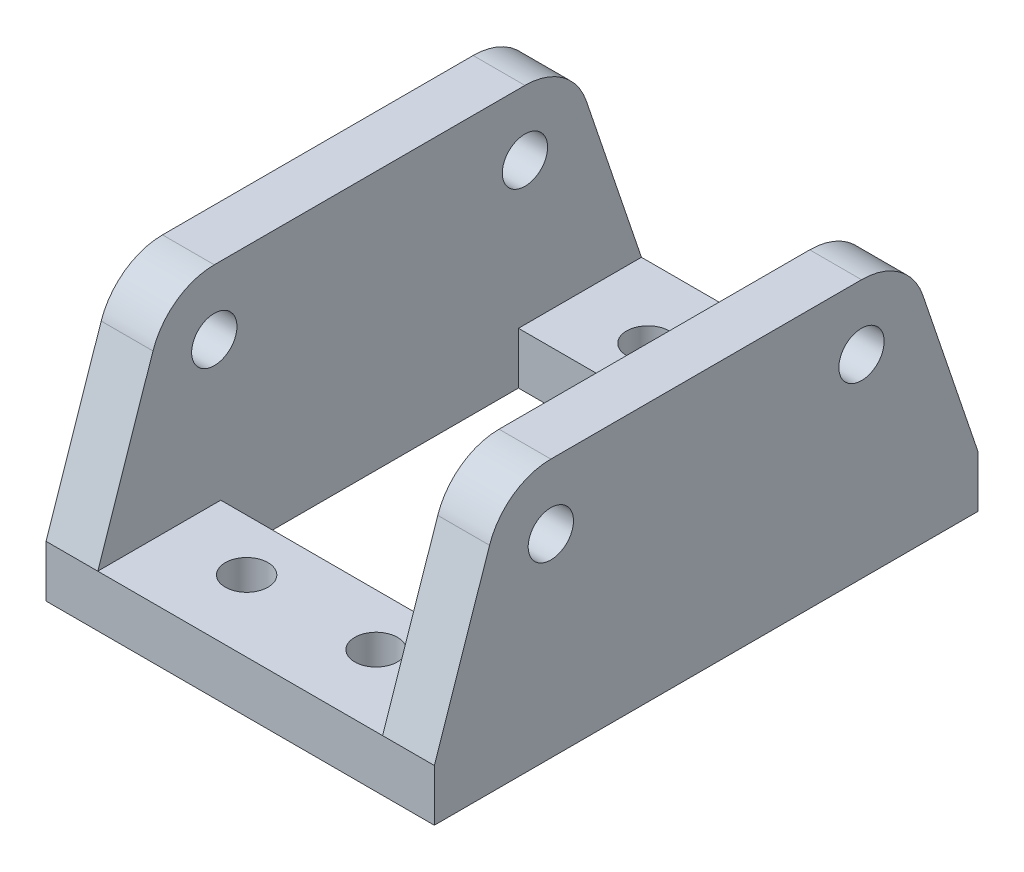
ISO-10303-21;
HEADER;
FILE_DESCRIPTION(('STEP AP214'),'2;1');
FILE_NAME('part.step','',(''),(''),'','','');
FILE_SCHEMA(('AUTOMOTIVE_DESIGN { 1 0 10303 214 1 1 1 1 }'));
ENDSEC;
DATA;
#1=APPLICATION_CONTEXT('core data for automotive mechanical design processes');
#2=APPLICATION_PROTOCOL_DEFINITION('international standard','automotive_design',2000,#1);
#3=PRODUCT_CONTEXT('',#1,'mechanical');
#4=PRODUCT('Part','Part','',(#3));
#5=PRODUCT_RELATED_PRODUCT_CATEGORY('part','',(#4));
#6=PRODUCT_DEFINITION_FORMATION('','',#4);
#7=PRODUCT_DEFINITION_CONTEXT('part definition',#1,'design');
#8=PRODUCT_DEFINITION('design','',#6,#7);
#9=PRODUCT_DEFINITION_SHAPE('','',#8);
#10=(LENGTH_UNIT() NAMED_UNIT(*) SI_UNIT(.MILLI.,.METRE.));
#11=(NAMED_UNIT(*) PLANE_ANGLE_UNIT() SI_UNIT($,.RADIAN.));
#12=(NAMED_UNIT(*) SI_UNIT($,.STERADIAN.) SOLID_ANGLE_UNIT());
#13=UNCERTAINTY_MEASURE_WITH_UNIT(LENGTH_MEASURE(1.E-05),#10,'distance_accuracy_value','');
#14=(GEOMETRIC_REPRESENTATION_CONTEXT(3) GLOBAL_UNCERTAINTY_ASSIGNED_CONTEXT((#13)) GLOBAL_UNIT_ASSIGNED_CONTEXT((#10,
#11,#12)) REPRESENTATION_CONTEXT('',''));
#15=CARTESIAN_POINT('',(0.,0.,0.));
#16=DIRECTION('',(0.,0.,1.));
#17=DIRECTION('',(1.,0.,0.));
#18=AXIS2_PLACEMENT_3D('',#15,#16,#17);
#19=CARTESIAN_POINT('',(0.,20.,0.));
#20=DIRECTION('',(0.,1.,0.));
#21=DIRECTION('',(0.,0.,1.));
#22=AXIS2_PLACEMENT_3D('',#19,#20,#21);
#23=PLANE('',#22);
#24=DIRECTION('',(0.,0.,1.));
#25=VECTOR('',#24,1.);
#26=CARTESIAN_POINT('',(-15.,20.,-25.));
#27=LINE('',#26,#25);
#28=CARTESIAN_POINT('',(-15.,20.,-12.));
#29=VERTEX_POINT('',#28);
#30=CARTESIAN_POINT('',(-15.,20.,12.));
#31=VERTEX_POINT('',#30);
#32=EDGE_CURVE('E42',#29,#31,#27,.T.);
#33=ORIENTED_EDGE('',*,*,#32,.T.);
#34=DIRECTION('',(-1.,0.,0.));
#35=VECTOR('',#34,1.);
#36=CARTESIAN_POINT('',(15.,20.,12.));
#37=LINE('',#36,#35);
#38=CARTESIAN_POINT('',(-11.,20.,12.));
#39=VERTEX_POINT('',#38);
#40=EDGE_CURVE('E82',#39,#31,#37,.T.);
#41=ORIENTED_EDGE('',*,*,#40,.F.);
#42=DIRECTION('',(0.,0.,1.));
#43=VECTOR('',#42,1.);
#44=CARTESIAN_POINT('',(-11.,20.,-21.));
#45=LINE('',#44,#43);
#46=CARTESIAN_POINT('',(-11.,20.,-12.));
#47=VERTEX_POINT('',#46);
#48=EDGE_CURVE('E117',#47,#39,#45,.T.);
#49=ORIENTED_EDGE('',*,*,#48,.F.);
#50=DIRECTION('',(-1.,0.,0.));
#51=VECTOR('',#50,1.);
#52=CARTESIAN_POINT('',(15.,20.,-12.));
#53=LINE('',#52,#51);
#54=EDGE_CURVE('E106',#47,#29,#53,.T.);
#55=ORIENTED_EDGE('',*,*,#54,.T.);
#56=EDGE_LOOP('',(#33,#41,#49,#55));
#57=FACE_BOUND('',#56,.T.);
#58=ADVANCED_FACE('F32',(#57),#23,.T.);
#59=DIRECTION('',(0.,0.,-1.));
#60=VECTOR('',#59,1.);
#61=CARTESIAN_POINT('',(11.,20.,-21.));
#62=LINE('',#61,#60);
#63=CARTESIAN_POINT('',(11.,20.,12.));
#64=VERTEX_POINT('',#63);
#65=CARTESIAN_POINT('',(11.,20.,-12.));
#66=VERTEX_POINT('',#65);
#67=EDGE_CURVE('E286',#64,#66,#62,.T.);
#68=ORIENTED_EDGE('',*,*,#67,.F.);
#69=CARTESIAN_POINT('',(15.,20.,12.));
#70=VERTEX_POINT('',#69);
#71=EDGE_CURVE('E93',#70,#64,#37,.T.);
#72=ORIENTED_EDGE('',*,*,#71,.F.);
#73=DIRECTION('',(0.,0.,-1.));
#74=VECTOR('',#73,1.);
#75=CARTESIAN_POINT('',(15.,20.,-25.));
#76=LINE('',#75,#74);
#77=CARTESIAN_POINT('',(15.,20.,-12.));
#78=VERTEX_POINT('',#77);
#79=EDGE_CURVE('E11',#70,#78,#76,.T.);
#80=ORIENTED_EDGE('',*,*,#79,.T.);
#81=EDGE_CURVE('E187',#78,#66,#53,.T.);
#82=ORIENTED_EDGE('',*,*,#81,.T.);
#83=EDGE_LOOP('',(#68,#72,#80,#82));
#84=FACE_BOUND('',#83,.T.);
#85=ADVANCED_FACE('F421',(#84),#23,.T.);
#86=CARTESIAN_POINT('',(11.,20.,-21.));
#87=DIRECTION('',(-1.,0.,0.));
#88=DIRECTION('',(0.,0.,1.));
#89=AXIS2_PLACEMENT_3D('',#86,#87,#88);
#90=PLANE('',#89);
#91=CARTESIAN_POINT('',(11.,15.,12.));
#92=DIRECTION('',(-1.,0.,0.));
#93=DIRECTION('',(0.,0.,1.));
#94=AXIS2_PLACEMENT_3D('',#91,#92,#93);
#95=CIRCLE('',#94,5.);
#96=CARTESIAN_POINT('',(11.,16.6024062440805,16.7362742983206));
#97=VERTEX_POINT('',#96);
#98=EDGE_CURVE('E168',#64,#97,#95,.F.);
#99=ORIENTED_EDGE('',*,*,#98,.F.);
#100=ORIENTED_EDGE('',*,*,#67,.T.);
#101=CARTESIAN_POINT('',(11.,15.,-12.));
#102=DIRECTION('',(-1.,0.,0.));
#103=DIRECTION('',(0.,0.,1.));
#104=AXIS2_PLACEMENT_3D('',#101,#102,#103);
#105=CIRCLE('',#104,4.99999999999999);
#106=CARTESIAN_POINT('',(11.,16.6024062440805,-16.7362742983206));
#107=VERTEX_POINT('',#106);
#108=EDGE_CURVE('E206',#107,#66,#105,.F.);
#109=ORIENTED_EDGE('',*,*,#108,.F.);
#110=DIRECTION('',(0.,0.947254859664113,0.320481248816093));
#111=VECTOR('',#110,1.);
#112=CARTESIAN_POINT('',(11.,18.3566683065164,-16.1427612740437));
#113=LINE('',#112,#111);
#114=CARTESIAN_POINT('',(11.,4.,-21.));
#115=VERTEX_POINT('',#114);
#116=EDGE_CURVE('E135',#115,#107,#113,.T.);
#117=ORIENTED_EDGE('',*,*,#116,.F.);
#118=DIRECTION('',(0.,0.,-1.));
#119=VECTOR('',#118,1.);
#120=CARTESIAN_POINT('',(11.,4.,-11.5));
#121=LINE('',#120,#119);
#122=CARTESIAN_POINT('',(11.,4.,-11.5));
#123=VERTEX_POINT('',#122);
#124=EDGE_CURVE('E258',#123,#115,#121,.T.);
#125=ORIENTED_EDGE('',*,*,#124,.F.);
#126=DIRECTION('',(0.,-1.,0.));
#127=VECTOR('',#126,1.);
#128=CARTESIAN_POINT('',(11.,4.,-11.5));
#129=LINE('',#128,#127);
#130=CARTESIAN_POINT('',(11.,0.,-11.5));
#131=VERTEX_POINT('',#130);
#132=EDGE_CURVE('E263',#123,#131,#129,.T.);
#133=ORIENTED_EDGE('',*,*,#132,.T.);
#134=DIRECTION('',(0.,0.,-1.));
#135=VECTOR('',#134,1.);
#136=CARTESIAN_POINT('',(11.,0.,-21.));
#137=LINE('',#136,#135);
#138=CARTESIAN_POINT('',(11.,0.,11.5));
#139=VERTEX_POINT('',#138);
#140=EDGE_CURVE('E285',#139,#131,#137,.T.);
#141=ORIENTED_EDGE('',*,*,#140,.F.);
#142=DIRECTION('',(0.,-1.,0.));
#143=VECTOR('',#142,1.);
#144=CARTESIAN_POINT('',(11.,4.,11.5));
#145=LINE('',#144,#143);
#146=CARTESIAN_POINT('',(11.,4.,11.5));
#147=VERTEX_POINT('',#146);
#148=EDGE_CURVE('E239',#147,#139,#145,.T.);
#149=ORIENTED_EDGE('',*,*,#148,.F.);
#150=DIRECTION('',(0.,0.,-1.));
#151=VECTOR('',#150,1.);
#152=CARTESIAN_POINT('',(11.,4.,11.5));
#153=LINE('',#152,#151);
#154=CARTESIAN_POINT('',(11.,4.,21.));
#155=VERTEX_POINT('',#154);
#156=EDGE_CURVE('E228',#155,#147,#153,.T.);
#157=ORIENTED_EDGE('',*,*,#156,.F.);
#158=DIRECTION('',(0.,-0.947254859664113,0.320481248816093));
#159=VECTOR('',#158,1.);
#160=CARTESIAN_POINT('',(11.,31.1069199621517,11.8290155786494));
#161=LINE('',#160,#159);
#162=EDGE_CURVE('E140',#97,#155,#161,.T.);
#163=ORIENTED_EDGE('',*,*,#162,.F.);
#164=EDGE_LOOP('',(#99,#100,#109,#117,#125,#133,#141,#149,#157,#163));
#165=FACE_BOUND('',#164,.T.);
#166=CARTESIAN_POINT('',(11.,15.,-12.));
#167=DIRECTION('',(-1.,0.,0.));
#168=DIRECTION('',(0.,0.,1.));
#169=AXIS2_PLACEMENT_3D('',#166,#167,#168);
#170=CIRCLE('',#169,1.75);
#171=CARTESIAN_POINT('',(11.,15.,-10.25));
#172=VERTEX_POINT('',#171);
#173=EDGE_CURVE('E127',#172,#172,#170,.T.);
#174=ORIENTED_EDGE('',*,*,#173,.F.);
#175=EDGE_LOOP('',(#174));
#176=FACE_BOUND('',#175,.T.);
#177=CARTESIAN_POINT('',(11.,15.,12.));
#178=DIRECTION('',(-1.,0.,0.));
#179=DIRECTION('',(0.,0.,1.));
#180=AXIS2_PLACEMENT_3D('',#177,#178,#179);
#181=CIRCLE('',#180,1.75);
#182=CARTESIAN_POINT('',(11.,15.,13.75));
#183=VERTEX_POINT('',#182);
#184=EDGE_CURVE('E122',#183,#183,#181,.T.);
#185=ORIENTED_EDGE('',*,*,#184,.F.);
#186=EDGE_LOOP('',(#185));
#187=FACE_BOUND('',#186,.T.);
#188=ADVANCED_FACE('F402',(#165,#176,#187),#90,.T.);
#189=CARTESIAN_POINT('',(-11.,20.,-21.));
#190=DIRECTION('',(1.,0.,0.));
#191=DIRECTION('',(0.,0.,-1.));
#192=AXIS2_PLACEMENT_3D('',#189,#190,#191);
#193=PLANE('',#192);
#194=CARTESIAN_POINT('',(-11.,15.,12.));
#195=DIRECTION('',(1.,0.,0.));
#196=DIRECTION('',(0.,0.,-1.));
#197=AXIS2_PLACEMENT_3D('',#194,#195,#196);
#198=CIRCLE('',#197,5.);
#199=CARTESIAN_POINT('',(-11.,16.6024062440805,16.7362742983206));
#200=VERTEX_POINT('',#199);
#201=EDGE_CURVE('E88',#200,#39,#198,.F.);
#202=ORIENTED_EDGE('',*,*,#201,.F.);
#203=DIRECTION('',(0.,0.947254859664113,-0.320481248816093));
#204=VECTOR('',#203,1.);
#205=CARTESIAN_POINT('',(-11.,31.1069199621517,11.8290155786494));
#206=LINE('',#205,#204);
#207=CARTESIAN_POINT('',(-11.,4.,21.));
#208=VERTEX_POINT('',#207);
#209=EDGE_CURVE('E136',#208,#200,#206,.T.);
#210=ORIENTED_EDGE('',*,*,#209,.F.);
#211=DIRECTION('',(0.,0.,1.));
#212=VECTOR('',#211,1.);
#213=CARTESIAN_POINT('',(-11.,4.,11.5));
#214=LINE('',#213,#212);
#215=CARTESIAN_POINT('',(-11.,4.,11.5));
#216=VERTEX_POINT('',#215);
#217=EDGE_CURVE('E222',#216,#208,#214,.T.);
#218=ORIENTED_EDGE('',*,*,#217,.F.);
#219=DIRECTION('',(0.,-1.,0.));
#220=VECTOR('',#219,1.);
#221=CARTESIAN_POINT('',(-11.,4.,11.5));
#222=LINE('',#221,#220);
#223=CARTESIAN_POINT('',(-11.,0.,11.5));
#224=VERTEX_POINT('',#223);
#225=EDGE_CURVE('E234',#216,#224,#222,.T.);
#226=ORIENTED_EDGE('',*,*,#225,.T.);
#227=DIRECTION('',(0.,0.,1.));
#228=VECTOR('',#227,1.);
#229=CARTESIAN_POINT('',(-11.,0.,-21.));
#230=LINE('',#229,#228);
#231=CARTESIAN_POINT('',(-11.,0.,-11.5));
#232=VERTEX_POINT('',#231);
#233=EDGE_CURVE('E113',#232,#224,#230,.T.);
#234=ORIENTED_EDGE('',*,*,#233,.F.);
#235=DIRECTION('',(0.,-1.,0.));
#236=VECTOR('',#235,1.);
#237=CARTESIAN_POINT('',(-11.,4.,-11.5));
#238=LINE('',#237,#236);
#239=CARTESIAN_POINT('',(-11.,4.,-11.5));
#240=VERTEX_POINT('',#239);
#241=EDGE_CURVE('E268',#240,#232,#238,.T.);
#242=ORIENTED_EDGE('',*,*,#241,.F.);
#243=DIRECTION('',(0.,0.,1.));
#244=VECTOR('',#243,1.);
#245=CARTESIAN_POINT('',(-11.,4.,-11.5));
#246=LINE('',#245,#244);
#247=CARTESIAN_POINT('',(-11.,4.,-21.));
#248=VERTEX_POINT('',#247);
#249=EDGE_CURVE('E51',#248,#240,#246,.T.);
#250=ORIENTED_EDGE('',*,*,#249,.F.);
#251=DIRECTION('',(0.,-0.947254859664113,-0.320481248816093));
#252=VECTOR('',#251,1.);
#253=CARTESIAN_POINT('',(-11.,18.3566683065164,-16.1427612740437));
#254=LINE('',#253,#252);
#255=CARTESIAN_POINT('',(-11.,16.6024062440805,-16.7362742983206));
#256=VERTEX_POINT('',#255);
#257=EDGE_CURVE('E131',#256,#248,#254,.T.);
#258=ORIENTED_EDGE('',*,*,#257,.F.);
#259=CARTESIAN_POINT('',(-11.,15.,-12.));
#260=DIRECTION('',(1.,0.,0.));
#261=DIRECTION('',(0.,0.,-1.));
#262=AXIS2_PLACEMENT_3D('',#259,#260,#261);
#263=CIRCLE('',#262,4.99999999999999);
#264=EDGE_CURVE('E134',#47,#256,#263,.F.);
#265=ORIENTED_EDGE('',*,*,#264,.F.);
#266=ORIENTED_EDGE('',*,*,#48,.T.);
#267=EDGE_LOOP('',(#202,#210,#218,#226,#234,#242,#250,#258,#265,#266));
#268=FACE_BOUND('',#267,.T.);
#269=CARTESIAN_POINT('',(-11.,15.,-12.));
#270=DIRECTION('',(1.,0.,0.));
#271=DIRECTION('',(0.,0.,-1.));
#272=AXIS2_PLACEMENT_3D('',#269,#270,#271);
#273=CIRCLE('',#272,1.75);
#274=CARTESIAN_POINT('',(-11.,15.,-13.75));
#275=VERTEX_POINT('',#274);
#276=EDGE_CURVE('E124',#275,#275,#273,.T.);
#277=ORIENTED_EDGE('',*,*,#276,.F.);
#278=EDGE_LOOP('',(#277));
#279=FACE_BOUND('',#278,.T.);
#280=CARTESIAN_POINT('',(-11.,15.,12.));
#281=DIRECTION('',(1.,0.,0.));
#282=DIRECTION('',(0.,0.,-1.));
#283=AXIS2_PLACEMENT_3D('',#280,#281,#282);
#284=CIRCLE('',#283,1.75);
#285=CARTESIAN_POINT('',(-11.,15.,10.25));
#286=VERTEX_POINT('',#285);
#287=EDGE_CURVE('E119',#286,#286,#284,.T.);
#288=ORIENTED_EDGE('',*,*,#287,.F.);
#289=EDGE_LOOP('',(#288));
#290=FACE_BOUND('',#289,.T.);
#291=ADVANCED_FACE('F305',(#268,#279,#290),#193,.T.);
#292=CARTESIAN_POINT('',(0.,0.,0.));
#293=DIRECTION('',(0.,1.,0.));
#294=DIRECTION('',(0.,0.,1.));
#295=AXIS2_PLACEMENT_3D('',#292,#293,#294);
#296=PLANE('',#295);
#297=DIRECTION('',(-1.,0.,0.));
#298=VECTOR('',#297,1.);
#299=CARTESIAN_POINT('',(-11.,0.,11.5));
#300=LINE('',#299,#298);
#301=EDGE_CURVE('E219',#139,#224,#300,.T.);
#302=ORIENTED_EDGE('',*,*,#301,.F.);
#303=ORIENTED_EDGE('',*,*,#140,.T.);
#304=DIRECTION('',(1.,0.,0.));
#305=VECTOR('',#304,1.);
#306=CARTESIAN_POINT('',(-11.,0.,-11.5));
#307=LINE('',#306,#305);
#308=EDGE_CURVE('E252',#232,#131,#307,.T.);
#309=ORIENTED_EDGE('',*,*,#308,.F.);
#310=ORIENTED_EDGE('',*,*,#233,.T.);
#311=EDGE_LOOP('',(#302,#303,#309,#310));
#312=FACE_BOUND('',#311,.T.);
#313=DIRECTION('',(0.,0.,-1.));
#314=VECTOR('',#313,1.);
#315=CARTESIAN_POINT('',(15.,0.,-25.));
#316=LINE('',#315,#314);
#317=CARTESIAN_POINT('',(15.,0.,21.));
#318=VERTEX_POINT('',#317);
#319=CARTESIAN_POINT('',(15.,0.,-21.));
#320=VERTEX_POINT('',#319);
#321=EDGE_CURVE('E107',#318,#320,#316,.T.);
#322=ORIENTED_EDGE('',*,*,#321,.F.);
#323=DIRECTION('',(-1.,0.,0.));
#324=VECTOR('',#323,1.);
#325=CARTESIAN_POINT('',(15.,0.,21.));
#326=LINE('',#325,#324);
#327=CARTESIAN_POINT('',(-15.,0.,21.));
#328=VERTEX_POINT('',#327);
#329=EDGE_CURVE('E94',#318,#328,#326,.T.);
#330=ORIENTED_EDGE('',*,*,#329,.T.);
#331=DIRECTION('',(0.,0.,1.));
#332=VECTOR('',#331,1.);
#333=CARTESIAN_POINT('',(-15.,0.,-25.));
#334=LINE('',#333,#332);
#335=CARTESIAN_POINT('',(-15.,0.,-21.));
#336=VERTEX_POINT('',#335);
#337=EDGE_CURVE('E110',#336,#328,#334,.T.);
#338=ORIENTED_EDGE('',*,*,#337,.F.);
#339=DIRECTION('',(-1.,0.,0.));
#340=VECTOR('',#339,1.);
#341=CARTESIAN_POINT('',(15.,0.,-21.));
#342=LINE('',#341,#340);
#343=EDGE_CURVE('E179',#320,#336,#342,.T.);
#344=ORIENTED_EDGE('',*,*,#343,.F.);
#345=EDGE_LOOP('',(#322,#330,#338,#344));
#346=FACE_BOUND('',#345,.T.);
#347=CARTESIAN_POINT('',(-5.,0.,-15.5));
#348=DIRECTION('',(0.,1.,0.));
#349=DIRECTION('',(0.,0.,1.));
#350=AXIS2_PLACEMENT_3D('',#347,#348,#349);
#351=CIRCLE('',#350,1.65);
#352=CARTESIAN_POINT('',(-5.,0.,-13.85));
#353=VERTEX_POINT('',#352);
#354=EDGE_CURVE('E246',#353,#353,#351,.T.);
#355=ORIENTED_EDGE('',*,*,#354,.T.);
#356=EDGE_LOOP('',(#355));
#357=FACE_BOUND('',#356,.T.);
#358=CARTESIAN_POINT('',(4.99999999999999,0.,-15.5));
#359=DIRECTION('',(0.,1.,0.));
#360=DIRECTION('',(0.,0.,-1.));
#361=AXIS2_PLACEMENT_3D('',#358,#359,#360);
#362=CIRCLE('',#361,1.65);
#363=CARTESIAN_POINT('',(4.99999999999999,0.,-17.15));
#364=VERTEX_POINT('',#363);
#365=EDGE_CURVE('E242',#364,#364,#362,.T.);
#366=ORIENTED_EDGE('',*,*,#365,.T.);
#367=EDGE_LOOP('',(#366));
#368=FACE_BOUND('',#367,.T.);
#369=CARTESIAN_POINT('',(-5.,0.,15.5));
#370=DIRECTION('',(0.,1.,0.));
#371=DIRECTION('',(0.,0.,1.));
#372=AXIS2_PLACEMENT_3D('',#369,#370,#371);
#373=CIRCLE('',#372,1.65);
#374=CARTESIAN_POINT('',(-5.,0.,17.15));
#375=VERTEX_POINT('',#374);
#376=EDGE_CURVE('E213',#375,#375,#373,.T.);
#377=ORIENTED_EDGE('',*,*,#376,.T.);
#378=EDGE_LOOP('',(#377));
#379=FACE_BOUND('',#378,.T.);
#380=CARTESIAN_POINT('',(5.,0.,15.5));
#381=DIRECTION('',(0.,1.,0.));
#382=DIRECTION('',(0.,0.,-1.));
#383=AXIS2_PLACEMENT_3D('',#380,#381,#382);
#384=CIRCLE('',#383,1.65);
#385=CARTESIAN_POINT('',(5.,0.,13.85));
#386=VERTEX_POINT('',#385);
#387=EDGE_CURVE('E209',#386,#386,#384,.T.);
#388=ORIENTED_EDGE('',*,*,#387,.T.);
#389=EDGE_LOOP('',(#388));
#390=FACE_BOUND('',#389,.T.);
#391=ADVANCED_FACE('F297',(#312,#346,#357,#368,#379,#390),#296,.F.);
#392=CARTESIAN_POINT('',(-15.,20.,-25.));
#393=DIRECTION('',(1.,0.,0.));
#394=DIRECTION('',(0.,0.,-1.));
#395=AXIS2_PLACEMENT_3D('',#392,#393,#394);
#396=PLANE('',#395);
#397=CARTESIAN_POINT('',(-15.,15.,-12.));
#398=DIRECTION('',(1.,0.,0.));
#399=DIRECTION('',(0.,0.,-1.));
#400=AXIS2_PLACEMENT_3D('',#397,#398,#399);
#401=CIRCLE('',#400,1.75);
#402=CARTESIAN_POINT('',(-15.,15.,-13.75));
#403=VERTEX_POINT('',#402);
#404=EDGE_CURVE('E128',#403,#403,#401,.T.);
#405=ORIENTED_EDGE('',*,*,#404,.T.);
#406=EDGE_LOOP('',(#405));
#407=FACE_BOUND('',#406,.T.);
#408=CARTESIAN_POINT('',(-15.,15.,12.));
#409=DIRECTION('',(1.,0.,0.));
#410=DIRECTION('',(0.,0.,-1.));
#411=AXIS2_PLACEMENT_3D('',#408,#409,#410);
#412=CIRCLE('',#411,1.75);
#413=CARTESIAN_POINT('',(-15.,15.,10.25));
#414=VERTEX_POINT('',#413);
#415=EDGE_CURVE('E123',#414,#414,#412,.T.);
#416=ORIENTED_EDGE('',*,*,#415,.T.);
#417=EDGE_LOOP('',(#416));
#418=FACE_BOUND('',#417,.T.);
#419=DIRECTION('',(0.,0.947254859664113,-0.320481248816093));
#420=VECTOR('',#419,1.);
#421=CARTESIAN_POINT('',(-15.,16.6024062440805,16.7362742983206));
#422=LINE('',#421,#420);
#423=CARTESIAN_POINT('',(-15.,16.6024062440805,16.7362742983206));
#424=VERTEX_POINT('',#423);
#425=CARTESIAN_POINT('',(-15.,3.99999999999999,21.));
#426=VERTEX_POINT('',#425);
#427=EDGE_CURVE('E102',#424,#426,#422,.F.);
#428=ORIENTED_EDGE('',*,*,#427,.F.);
#429=CARTESIAN_POINT('',(-15.,15.,12.));
#430=DIRECTION('',(-1.,0.,0.));
#431=DIRECTION('',(0.,0.,1.));
#432=AXIS2_PLACEMENT_3D('',#429,#430,#431);
#433=CIRCLE('',#432,5.);
#434=EDGE_CURVE('E36',#31,#424,#433,.F.);
#435=ORIENTED_EDGE('',*,*,#434,.F.);
#436=ORIENTED_EDGE('',*,*,#32,.F.);
#437=CARTESIAN_POINT('',(-15.,15.,-12.));
#438=DIRECTION('',(-1.,0.,0.));
#439=DIRECTION('',(0.,0.,1.));
#440=AXIS2_PLACEMENT_3D('',#437,#438,#439);
#441=CIRCLE('',#440,4.99999999999999);
#442=CARTESIAN_POINT('',(-15.,16.6024062440805,-16.7362742983206));
#443=VERTEX_POINT('',#442);
#444=EDGE_CURVE('E133',#443,#29,#441,.F.);
#445=ORIENTED_EDGE('',*,*,#444,.F.);
#446=DIRECTION('',(0.,-0.947254859664113,-0.320481248816093));
#447=VECTOR('',#446,1.);
#448=CARTESIAN_POINT('',(-15.,16.6024062440805,-16.7362742983206));
#449=LINE('',#448,#447);
#450=CARTESIAN_POINT('',(-15.,4.,-21.));
#451=VERTEX_POINT('',#450);
#452=EDGE_CURVE('E129',#451,#443,#449,.F.);
#453=ORIENTED_EDGE('',*,*,#452,.F.);
#454=DIRECTION('',(0.,-1.,0.));
#455=VECTOR('',#454,1.);
#456=CARTESIAN_POINT('',(-15.,20.,-21.));
#457=LINE('',#456,#455);
#458=EDGE_CURVE('E132',#451,#336,#457,.T.);
#459=ORIENTED_EDGE('',*,*,#458,.T.);
#460=ORIENTED_EDGE('',*,*,#337,.T.);
#461=DIRECTION('',(0.,1.,0.));
#462=VECTOR('',#461,1.);
#463=CARTESIAN_POINT('',(-15.,20.,21.));
#464=LINE('',#463,#462);
#465=EDGE_CURVE('E103',#328,#426,#464,.T.);
#466=ORIENTED_EDGE('',*,*,#465,.T.);
#467=EDGE_LOOP('',(#428,#435,#436,#445,#453,#459,#460,#466));
#468=FACE_BOUND('',#467,.T.);
#469=ADVANCED_FACE('F34',(#407,#418,#468),#396,.F.);
#470=CARTESIAN_POINT('',(15.,20.,-25.));
#471=DIRECTION('',(-1.,0.,0.));
#472=DIRECTION('',(0.,0.,1.));
#473=AXIS2_PLACEMENT_3D('',#470,#471,#472);
#474=PLANE('',#473);
#475=ORIENTED_EDGE('',*,*,#79,.F.);
#476=CARTESIAN_POINT('',(15.,15.,12.));
#477=DIRECTION('',(1.,0.,0.));
#478=DIRECTION('',(0.,0.,-1.));
#479=AXIS2_PLACEMENT_3D('',#476,#477,#478);
#480=CIRCLE('',#479,5.);
#481=CARTESIAN_POINT('',(15.,16.6024062440805,16.7362742983206));
#482=VERTEX_POINT('',#481);
#483=EDGE_CURVE('E360',#70,#482,#480,.T.);
#484=ORIENTED_EDGE('',*,*,#483,.T.);
#485=DIRECTION('',(0.,-0.947254859664113,0.320481248816093));
#486=VECTOR('',#485,1.);
#487=CARTESIAN_POINT('',(15.,16.6024062440805,16.7362742983206));
#488=LINE('',#487,#486);
#489=CARTESIAN_POINT('',(15.,4.,21.));
#490=VERTEX_POINT('',#489);
#491=EDGE_CURVE('E364',#482,#490,#488,.T.);
#492=ORIENTED_EDGE('',*,*,#491,.T.);
#493=DIRECTION('',(0.,-1.,0.));
#494=VECTOR('',#493,1.);
#495=CARTESIAN_POINT('',(15.,4.,21.));
#496=LINE('',#495,#494);
#497=EDGE_CURVE('E369',#490,#318,#496,.T.);
#498=ORIENTED_EDGE('',*,*,#497,.T.);
#499=ORIENTED_EDGE('',*,*,#321,.T.);
#500=DIRECTION('',(0.,1.,0.));
#501=VECTOR('',#500,1.);
#502=CARTESIAN_POINT('',(15.,4.,-21.));
#503=LINE('',#502,#501);
#504=CARTESIAN_POINT('',(15.,4.,-21.));
#505=VERTEX_POINT('',#504);
#506=EDGE_CURVE('E170',#320,#505,#503,.T.);
#507=ORIENTED_EDGE('',*,*,#506,.T.);
#508=DIRECTION('',(0.,0.947254859664113,0.320481248816093));
#509=VECTOR('',#508,1.);
#510=CARTESIAN_POINT('',(15.,16.6024062440805,-16.7362742983206));
#511=LINE('',#510,#509);
#512=CARTESIAN_POINT('',(15.,16.6024062440805,-16.7362742983206));
#513=VERTEX_POINT('',#512);
#514=EDGE_CURVE('E173',#505,#513,#511,.T.);
#515=ORIENTED_EDGE('',*,*,#514,.T.);
#516=CARTESIAN_POINT('',(15.,15.,-12.));
#517=DIRECTION('',(1.,0.,0.));
#518=DIRECTION('',(0.,0.,1.));
#519=AXIS2_PLACEMENT_3D('',#516,#517,#518);
#520=CIRCLE('',#519,4.99999999999999);
#521=EDGE_CURVE('E176',#513,#78,#520,.T.);
#522=ORIENTED_EDGE('',*,*,#521,.T.);
#523=EDGE_LOOP('',(#475,#484,#492,#498,#499,#507,#515,#522));
#524=FACE_BOUND('',#523,.T.);
#525=CARTESIAN_POINT('',(15.,15.,-12.));
#526=DIRECTION('',(1.,0.,0.));
#527=DIRECTION('',(0.,0.,-1.));
#528=AXIS2_PLACEMENT_3D('',#525,#526,#527);
#529=CIRCLE('',#528,1.75);
#530=CARTESIAN_POINT('',(15.,15.,-13.75));
#531=VERTEX_POINT('',#530);
#532=EDGE_CURVE('E271',#531,#531,#529,.T.);
#533=ORIENTED_EDGE('',*,*,#532,.F.);
#534=EDGE_LOOP('',(#533));
#535=FACE_BOUND('',#534,.T.);
#536=CARTESIAN_POINT('',(15.,15.,12.));
#537=DIRECTION('',(1.,0.,0.));
#538=DIRECTION('',(0.,0.,-1.));
#539=AXIS2_PLACEMENT_3D('',#536,#537,#538);
#540=CIRCLE('',#539,1.75);
#541=CARTESIAN_POINT('',(15.,15.,10.25));
#542=VERTEX_POINT('',#541);
#543=EDGE_CURVE('E278',#542,#542,#540,.T.);
#544=ORIENTED_EDGE('',*,*,#543,.F.);
#545=EDGE_LOOP('',(#544));
#546=FACE_BOUND('',#545,.T.);
#547=ADVANCED_FACE('F372',(#524,#535,#546),#474,.F.);
#548=CARTESIAN_POINT('',(-15.,15.,12.));
#549=DIRECTION('',(1.,0.,0.));
#550=DIRECTION('',(0.,0.,-1.));
#551=AXIS2_PLACEMENT_3D('',#548,#549,#550);
#552=CYLINDRICAL_SURFACE('',#551,1.75);
#553=ORIENTED_EDGE('',*,*,#287,.T.);
#554=EDGE_LOOP('',(#553));
#555=FACE_BOUND('',#554,.T.);
#556=ORIENTED_EDGE('',*,*,#415,.F.);
#557=EDGE_LOOP('',(#556));
#558=FACE_BOUND('',#557,.T.);
#559=ADVANCED_FACE('F432',(#555,#558),#552,.F.);
#560=ORIENTED_EDGE('',*,*,#184,.T.);
#561=EDGE_LOOP('',(#560));
#562=FACE_BOUND('',#561,.T.);
#563=ORIENTED_EDGE('',*,*,#543,.T.);
#564=EDGE_LOOP('',(#563));
#565=FACE_BOUND('',#564,.T.);
#566=ADVANCED_FACE('F437',(#562,#565),#552,.F.);
#567=CARTESIAN_POINT('',(-15.,15.,-12.));
#568=DIRECTION('',(1.,0.,0.));
#569=DIRECTION('',(0.,0.,-1.));
#570=AXIS2_PLACEMENT_3D('',#567,#568,#569);
#571=CYLINDRICAL_SURFACE('',#570,1.75);
#572=ORIENTED_EDGE('',*,*,#276,.T.);
#573=EDGE_LOOP('',(#572));
#574=FACE_BOUND('',#573,.T.);
#575=ORIENTED_EDGE('',*,*,#404,.F.);
#576=EDGE_LOOP('',(#575));
#577=FACE_BOUND('',#576,.T.);
#578=ADVANCED_FACE('F448',(#574,#577),#571,.F.);
#579=ORIENTED_EDGE('',*,*,#173,.T.);
#580=EDGE_LOOP('',(#579));
#581=FACE_BOUND('',#580,.T.);
#582=ORIENTED_EDGE('',*,*,#532,.T.);
#583=EDGE_LOOP('',(#582));
#584=FACE_BOUND('',#583,.T.);
#585=ADVANCED_FACE('F450',(#581,#584),#571,.F.);
#586=CARTESIAN_POINT('',(0.,4.,0.));
#587=DIRECTION('',(0.,-1.,0.));
#588=DIRECTION('',(0.,0.,-1.));
#589=AXIS2_PLACEMENT_3D('',#586,#587,#588);
#590=PLANE('',#589);
#591=ORIENTED_EDGE('',*,*,#249,.T.);
#592=DIRECTION('',(1.,0.,0.));
#593=VECTOR('',#592,1.);
#594=CARTESIAN_POINT('',(-11.,4.,-11.5));
#595=LINE('',#594,#593);
#596=EDGE_CURVE('E256',#240,#123,#595,.T.);
#597=ORIENTED_EDGE('',*,*,#596,.T.);
#598=ORIENTED_EDGE('',*,*,#124,.T.);
#599=DIRECTION('',(-1.,0.,0.));
#600=VECTOR('',#599,1.);
#601=CARTESIAN_POINT('',(-11.,4.,-21.));
#602=LINE('',#601,#600);
#603=EDGE_CURVE('E261',#115,#248,#602,.T.);
#604=ORIENTED_EDGE('',*,*,#603,.T.);
#605=EDGE_LOOP('',(#591,#597,#598,#604));
#606=FACE_BOUND('',#605,.T.);
#607=CARTESIAN_POINT('',(-5.,4.,-15.5));
#608=DIRECTION('',(0.,1.,0.));
#609=DIRECTION('',(0.,0.,1.));
#610=AXIS2_PLACEMENT_3D('',#607,#608,#609);
#611=CIRCLE('',#610,1.65);
#612=CARTESIAN_POINT('',(-5.,4.,-13.85));
#613=VERTEX_POINT('',#612);
#614=EDGE_CURVE('E249',#613,#613,#611,.T.);
#615=ORIENTED_EDGE('',*,*,#614,.F.);
#616=EDGE_LOOP('',(#615));
#617=FACE_BOUND('',#616,.T.);
#618=CARTESIAN_POINT('',(4.99999999999999,4.,-15.5));
#619=DIRECTION('',(0.,1.,0.));
#620=DIRECTION('',(0.,0.,-1.));
#621=AXIS2_PLACEMENT_3D('',#618,#619,#620);
#622=CIRCLE('',#621,1.65);
#623=CARTESIAN_POINT('',(4.99999999999999,4.,-17.15));
#624=VERTEX_POINT('',#623);
#625=EDGE_CURVE('E243',#624,#624,#622,.T.);
#626=ORIENTED_EDGE('',*,*,#625,.F.);
#627=EDGE_LOOP('',(#626));
#628=FACE_BOUND('',#627,.T.);
#629=ADVANCED_FACE('F457',(#606,#617,#628),#590,.F.);
#630=CARTESIAN_POINT('',(-11.,4.,-11.5));
#631=DIRECTION('',(0.,0.,-1.));
#632=DIRECTION('',(-1.,0.,0.));
#633=AXIS2_PLACEMENT_3D('',#630,#631,#632);
#634=PLANE('',#633);
#635=ORIENTED_EDGE('',*,*,#308,.T.);
#636=ORIENTED_EDGE('',*,*,#132,.F.);
#637=ORIENTED_EDGE('',*,*,#596,.F.);
#638=ORIENTED_EDGE('',*,*,#241,.T.);
#639=EDGE_LOOP('',(#635,#636,#637,#638));
#640=FACE_BOUND('',#639,.T.);
#641=ADVANCED_FACE('F461',(#640),#634,.F.);
#642=CARTESIAN_POINT('',(-5.,4.,-15.5));
#643=DIRECTION('',(0.,-1.,0.));
#644=DIRECTION('',(0.,0.,-1.));
#645=AXIS2_PLACEMENT_3D('',#642,#643,#644);
#646=CYLINDRICAL_SURFACE('',#645,1.65);
#647=ORIENTED_EDGE('',*,*,#614,.T.);
#648=EDGE_LOOP('',(#647));
#649=FACE_BOUND('',#648,.T.);
#650=ORIENTED_EDGE('',*,*,#354,.F.);
#651=EDGE_LOOP('',(#650));
#652=FACE_BOUND('',#651,.T.);
#653=ADVANCED_FACE('F509',(#649,#652),#646,.F.);
#654=CARTESIAN_POINT('',(4.99999999999999,4.,-15.5));
#655=DIRECTION('',(0.,-1.,0.));
#656=DIRECTION('',(0.,0.,-1.));
#657=AXIS2_PLACEMENT_3D('',#654,#655,#656);
#658=CYLINDRICAL_SURFACE('',#657,1.65);
#659=ORIENTED_EDGE('',*,*,#625,.T.);
#660=EDGE_LOOP('',(#659));
#661=FACE_BOUND('',#660,.T.);
#662=ORIENTED_EDGE('',*,*,#365,.F.);
#663=EDGE_LOOP('',(#662));
#664=FACE_BOUND('',#663,.T.);
#665=ADVANCED_FACE('F416',(#661,#664),#658,.F.);
#666=CARTESIAN_POINT('',(0.,4.,0.));
#667=DIRECTION('',(0.,1.,0.));
#668=DIRECTION('',(0.,0.,1.));
#669=AXIS2_PLACEMENT_3D('',#666,#667,#668);
#670=PLANE('',#669);
#671=CARTESIAN_POINT('',(-5.,4.,15.5));
#672=DIRECTION('',(0.,1.,0.));
#673=DIRECTION('',(0.,0.,1.));
#674=AXIS2_PLACEMENT_3D('',#671,#672,#673);
#675=CIRCLE('',#674,1.65);
#676=CARTESIAN_POINT('',(-5.,4.,17.15));
#677=VERTEX_POINT('',#676);
#678=EDGE_CURVE('E216',#677,#677,#675,.T.);
#679=ORIENTED_EDGE('',*,*,#678,.F.);
#680=EDGE_LOOP('',(#679));
#681=FACE_BOUND('',#680,.T.);
#682=ORIENTED_EDGE('',*,*,#217,.T.);
#683=DIRECTION('',(1.,0.,0.));
#684=VECTOR('',#683,1.);
#685=CARTESIAN_POINT('',(-11.,4.,21.));
#686=LINE('',#685,#684);
#687=EDGE_CURVE('E225',#208,#155,#686,.T.);
#688=ORIENTED_EDGE('',*,*,#687,.T.);
#689=ORIENTED_EDGE('',*,*,#156,.T.);
#690=DIRECTION('',(-1.,0.,0.));
#691=VECTOR('',#690,1.);
#692=CARTESIAN_POINT('',(-11.,4.,11.5));
#693=LINE('',#692,#691);
#694=EDGE_CURVE('E231',#147,#216,#693,.T.);
#695=ORIENTED_EDGE('',*,*,#694,.T.);
#696=EDGE_LOOP('',(#682,#688,#689,#695));
#697=FACE_BOUND('',#696,.T.);
#698=CARTESIAN_POINT('',(5.,4.,15.5));
#699=DIRECTION('',(0.,1.,0.));
#700=DIRECTION('',(0.,0.,-1.));
#701=AXIS2_PLACEMENT_3D('',#698,#699,#700);
#702=CIRCLE('',#701,1.65);
#703=CARTESIAN_POINT('',(5.,4.,13.85));
#704=VERTEX_POINT('',#703);
#705=EDGE_CURVE('E210',#704,#704,#702,.T.);
#706=ORIENTED_EDGE('',*,*,#705,.F.);
#707=EDGE_LOOP('',(#706));
#708=FACE_BOUND('',#707,.T.);
#709=ADVANCED_FACE('F397',(#681,#697,#708),#670,.T.);
#710=CARTESIAN_POINT('',(-11.,4.,11.5));
#711=DIRECTION('',(0.,0.,1.));
#712=DIRECTION('',(1.,0.,0.));
#713=AXIS2_PLACEMENT_3D('',#710,#711,#712);
#714=PLANE('',#713);
#715=ORIENTED_EDGE('',*,*,#301,.T.);
#716=ORIENTED_EDGE('',*,*,#225,.F.);
#717=ORIENTED_EDGE('',*,*,#694,.F.);
#718=ORIENTED_EDGE('',*,*,#148,.T.);
#719=EDGE_LOOP('',(#715,#716,#717,#718));
#720=FACE_BOUND('',#719,.T.);
#721=ADVANCED_FACE('F405',(#720),#714,.F.);
#722=CARTESIAN_POINT('',(-5.,4.,15.5));
#723=DIRECTION('',(0.,-1.,0.));
#724=DIRECTION('',(0.,0.,-1.));
#725=AXIS2_PLACEMENT_3D('',#722,#723,#724);
#726=CYLINDRICAL_SURFACE('',#725,1.65);
#727=ORIENTED_EDGE('',*,*,#678,.T.);
#728=EDGE_LOOP('',(#727));
#729=FACE_BOUND('',#728,.T.);
#730=ORIENTED_EDGE('',*,*,#376,.F.);
#731=EDGE_LOOP('',(#730));
#732=FACE_BOUND('',#731,.T.);
#733=ADVANCED_FACE('F407',(#729,#732),#726,.F.);
#734=CARTESIAN_POINT('',(5.,4.,15.5));
#735=DIRECTION('',(0.,-1.,0.));
#736=DIRECTION('',(0.,0.,-1.));
#737=AXIS2_PLACEMENT_3D('',#734,#735,#736);
#738=CYLINDRICAL_SURFACE('',#737,1.65);
#739=ORIENTED_EDGE('',*,*,#705,.T.);
#740=EDGE_LOOP('',(#739));
#741=FACE_BOUND('',#740,.T.);
#742=ORIENTED_EDGE('',*,*,#387,.F.);
#743=EDGE_LOOP('',(#742));
#744=FACE_BOUND('',#743,.T.);
#745=ADVANCED_FACE('F413',(#741,#744),#738,.F.);
#746=CARTESIAN_POINT('',(15.,15.,-12.));
#747=DIRECTION('',(-1.,0.,0.));
#748=DIRECTION('',(0.,0.,1.));
#749=AXIS2_PLACEMENT_3D('',#746,#747,#748);
#750=CYLINDRICAL_SURFACE('',#749,4.99999999999999);
#751=ORIENTED_EDGE('',*,*,#108,.T.);
#752=ORIENTED_EDGE('',*,*,#81,.F.);
#753=ORIENTED_EDGE('',*,*,#521,.F.);
#754=DIRECTION('',(-1.,0.,0.));
#755=VECTOR('',#754,1.);
#756=CARTESIAN_POINT('',(15.,16.6024062440805,-16.7362742983206));
#757=LINE('',#756,#755);
#758=EDGE_CURVE('E183',#513,#107,#757,.T.);
#759=ORIENTED_EDGE('',*,*,#758,.T.);
#760=EDGE_LOOP('',(#751,#752,#753,#759));
#761=FACE_BOUND('',#760,.T.);
#762=ADVANCED_FACE('F487',(#761),#750,.T.);
#763=ORIENTED_EDGE('',*,*,#264,.T.);
#764=EDGE_CURVE('E186',#256,#443,#757,.T.);
#765=ORIENTED_EDGE('',*,*,#764,.T.);
#766=ORIENTED_EDGE('',*,*,#444,.T.);
#767=ORIENTED_EDGE('',*,*,#54,.F.);
#768=EDGE_LOOP('',(#763,#765,#766,#767));
#769=FACE_BOUND('',#768,.T.);
#770=ADVANCED_FACE('F383',(#769),#750,.T.);
#771=CARTESIAN_POINT('',(15.,16.6024062440805,-16.7362742983206));
#772=DIRECTION('',(0.,-0.320481248816093,0.947254859664112));
#773=DIRECTION('',(0.,-0.947254859664113,-0.320481248816093));
#774=AXIS2_PLACEMENT_3D('',#771,#772,#773);
#775=PLANE('',#774);
#776=ORIENTED_EDGE('',*,*,#116,.T.);
#777=ORIENTED_EDGE('',*,*,#758,.F.);
#778=ORIENTED_EDGE('',*,*,#514,.F.);
#779=DIRECTION('',(-1.,0.,0.));
#780=VECTOR('',#779,1.);
#781=CARTESIAN_POINT('',(15.,4.,-21.));
#782=LINE('',#781,#780);
#783=EDGE_CURVE('E192',#505,#115,#782,.T.);
#784=ORIENTED_EDGE('',*,*,#783,.T.);
#785=EDGE_LOOP('',(#776,#777,#778,#784));
#786=FACE_BOUND('',#785,.T.);
#787=ADVANCED_FACE('F618',(#786),#775,.F.);
#788=ORIENTED_EDGE('',*,*,#257,.T.);
#789=EDGE_CURVE('E182',#248,#451,#782,.T.);
#790=ORIENTED_EDGE('',*,*,#789,.T.);
#791=ORIENTED_EDGE('',*,*,#452,.T.);
#792=ORIENTED_EDGE('',*,*,#764,.F.);
#793=EDGE_LOOP('',(#788,#790,#791,#792));
#794=FACE_BOUND('',#793,.T.);
#795=ADVANCED_FACE('F385',(#794),#775,.F.);
#796=CARTESIAN_POINT('',(15.,4.,-21.));
#797=DIRECTION('',(0.,0.,1.));
#798=DIRECTION('',(1.,0.,0.));
#799=AXIS2_PLACEMENT_3D('',#796,#797,#798);
#800=PLANE('',#799);
#801=ORIENTED_EDGE('',*,*,#789,.F.);
#802=ORIENTED_EDGE('',*,*,#603,.F.);
#803=ORIENTED_EDGE('',*,*,#783,.F.);
#804=ORIENTED_EDGE('',*,*,#506,.F.);
#805=ORIENTED_EDGE('',*,*,#343,.T.);
#806=ORIENTED_EDGE('',*,*,#458,.F.);
#807=EDGE_LOOP('',(#801,#802,#803,#804,#805,#806));
#808=FACE_BOUND('',#807,.T.);
#809=ADVANCED_FACE('F635',(#808),#800,.F.);
#810=CARTESIAN_POINT('',(15.,15.,12.));
#811=DIRECTION('',(-1.,0.,0.));
#812=DIRECTION('',(0.,0.,1.));
#813=AXIS2_PLACEMENT_3D('',#810,#811,#812);
#814=CYLINDRICAL_SURFACE('',#813,5.);
#815=ORIENTED_EDGE('',*,*,#98,.T.);
#816=DIRECTION('',(-1.,0.,0.));
#817=VECTOR('',#816,1.);
#818=CARTESIAN_POINT('',(15.,16.6024062440805,16.7362742983206));
#819=LINE('',#818,#817);
#820=EDGE_CURVE('E154',#482,#97,#819,.T.);
#821=ORIENTED_EDGE('',*,*,#820,.F.);
#822=ORIENTED_EDGE('',*,*,#483,.F.);
#823=ORIENTED_EDGE('',*,*,#71,.T.);
#824=EDGE_LOOP('',(#815,#821,#822,#823));
#825=FACE_BOUND('',#824,.T.);
#826=ADVANCED_FACE('F358',(#825),#814,.T.);
#827=ORIENTED_EDGE('',*,*,#201,.T.);
#828=ORIENTED_EDGE('',*,*,#40,.T.);
#829=ORIENTED_EDGE('',*,*,#434,.T.);
#830=EDGE_CURVE('E158',#200,#424,#819,.T.);
#831=ORIENTED_EDGE('',*,*,#830,.F.);
#832=EDGE_LOOP('',(#827,#828,#829,#831));
#833=FACE_BOUND('',#832,.T.);
#834=ADVANCED_FACE('F84',(#833),#814,.T.);
#835=CARTESIAN_POINT('',(15.,4.,21.));
#836=DIRECTION('',(0.,0.,-1.));
#837=DIRECTION('',(-1.,0.,0.));
#838=AXIS2_PLACEMENT_3D('',#835,#836,#837);
#839=PLANE('',#838);
#840=ORIENTED_EDGE('',*,*,#329,.F.);
#841=ORIENTED_EDGE('',*,*,#497,.F.);
#842=DIRECTION('',(-1.,0.,0.));
#843=VECTOR('',#842,1.);
#844=CARTESIAN_POINT('',(15.,4.,21.));
#845=LINE('',#844,#843);
#846=EDGE_CURVE('E159',#490,#155,#845,.T.);
#847=ORIENTED_EDGE('',*,*,#846,.T.);
#848=ORIENTED_EDGE('',*,*,#687,.F.);
#849=EDGE_CURVE('E157',#208,#426,#845,.T.);
#850=ORIENTED_EDGE('',*,*,#849,.T.);
#851=ORIENTED_EDGE('',*,*,#465,.F.);
#852=EDGE_LOOP('',(#840,#841,#847,#848,#850,#851));
#853=FACE_BOUND('',#852,.T.);
#854=ADVANCED_FACE('F393',(#853),#839,.F.);
#855=CARTESIAN_POINT('',(15.,16.6024062440805,16.7362742983206));
#856=DIRECTION('',(0.,-0.320481248816093,-0.947254859664112));
#857=DIRECTION('',(0.,0.947254859664113,-0.320481248816093));
#858=AXIS2_PLACEMENT_3D('',#855,#856,#857);
#859=PLANE('',#858);
#860=ORIENTED_EDGE('',*,*,#162,.T.);
#861=ORIENTED_EDGE('',*,*,#846,.F.);
#862=ORIENTED_EDGE('',*,*,#491,.F.);
#863=ORIENTED_EDGE('',*,*,#820,.T.);
#864=EDGE_LOOP('',(#860,#861,#862,#863));
#865=FACE_BOUND('',#864,.T.);
#866=ADVANCED_FACE('F365',(#865),#859,.F.);
#867=ORIENTED_EDGE('',*,*,#209,.T.);
#868=ORIENTED_EDGE('',*,*,#830,.T.);
#869=ORIENTED_EDGE('',*,*,#427,.T.);
#870=ORIENTED_EDGE('',*,*,#849,.F.);
#871=EDGE_LOOP('',(#867,#868,#869,#870));
#872=FACE_BOUND('',#871,.T.);
#873=ADVANCED_FACE('F376',(#872),#859,.F.);
#874=CLOSED_SHELL('',(#58,#85,#188,#291,#391,#469,#547,#559,#566,#578,#585,#629,#641,#653,#665,
#709,#721,#733,#745,#762,#770,#787,#795,#809,#826,#834,#854,#866,#873));
#875=MANIFOLD_SOLID_BREP('B2',#874);
#876=ADVANCED_BREP_SHAPE_REPRESENTATION('',(#18,#875),#14);
#877=SHAPE_DEFINITION_REPRESENTATION(#9,#876);
ENDSEC;
END-ISO-10303-21;
